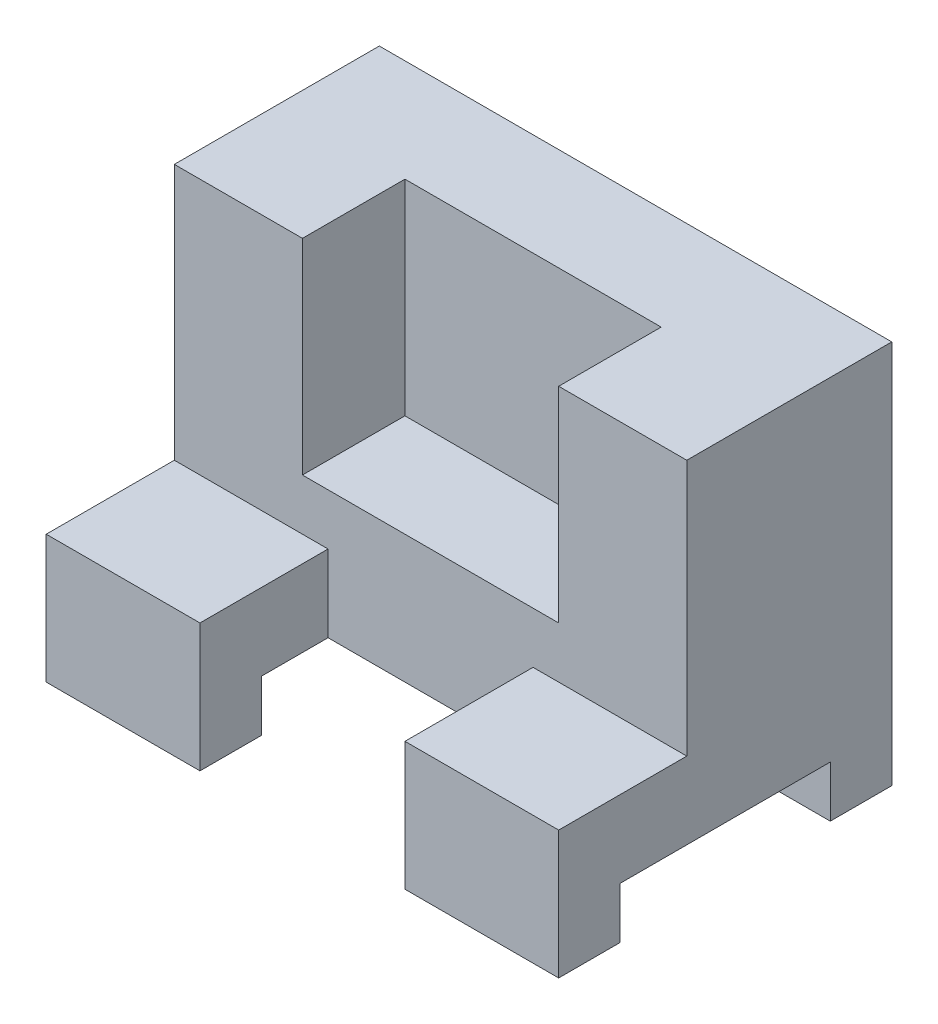
ISO-10303-21;
HEADER;
FILE_DESCRIPTION(('STEP AP214'),'2;1');
FILE_NAME('part.step','',(''),(''),'','','');
FILE_SCHEMA(('AUTOMOTIVE_DESIGN { 1 0 10303 214 1 1 1 1 }'));
ENDSEC;
DATA;
#1=APPLICATION_CONTEXT('core data for automotive mechanical design processes');
#2=APPLICATION_PROTOCOL_DEFINITION('international standard','automotive_design',2000,#1);
#3=PRODUCT_CONTEXT('',#1,'mechanical');
#4=PRODUCT('Part','Part','',(#3));
#5=PRODUCT_RELATED_PRODUCT_CATEGORY('part','',(#4));
#6=PRODUCT_DEFINITION_FORMATION('','',#4);
#7=PRODUCT_DEFINITION_CONTEXT('part definition',#1,'design');
#8=PRODUCT_DEFINITION('design','',#6,#7);
#9=PRODUCT_DEFINITION_SHAPE('','',#8);
#10=(LENGTH_UNIT() NAMED_UNIT(*) SI_UNIT(.MILLI.,.METRE.));
#11=(NAMED_UNIT(*) PLANE_ANGLE_UNIT() SI_UNIT($,.RADIAN.));
#12=(NAMED_UNIT(*) SI_UNIT($,.STERADIAN.) SOLID_ANGLE_UNIT());
#13=UNCERTAINTY_MEASURE_WITH_UNIT(LENGTH_MEASURE(1.E-05),#10,'distance_accuracy_value','');
#14=(GEOMETRIC_REPRESENTATION_CONTEXT(3) GLOBAL_UNCERTAINTY_ASSIGNED_CONTEXT((#13)) GLOBAL_UNIT_ASSIGNED_CONTEXT((#10,
#11,#12)) REPRESENTATION_CONTEXT('',''));
#15=CARTESIAN_POINT('',(0.,0.,0.));
#16=DIRECTION('',(0.,0.,1.));
#17=DIRECTION('',(1.,0.,0.));
#18=AXIS2_PLACEMENT_3D('',#15,#16,#17);
#19=CARTESIAN_POINT('',(0.,-65.,40.));
#20=DIRECTION('',(0.,1.,0.));
#21=DIRECTION('',(0.,0.,1.));
#22=AXIS2_PLACEMENT_3D('',#19,#20,#21);
#23=PLANE('',#22);
#24=DIRECTION('',(-1.,0.,0.));
#25=VECTOR('',#24,1.);
#26=CARTESIAN_POINT('',(0.,-65.,12.));
#27=LINE('',#26,#25);
#28=CARTESIAN_POINT('',(100.,-65.,12.));
#29=VERTEX_POINT('',#28);
#30=CARTESIAN_POINT('',(0.,-65.,12.));
#31=VERTEX_POINT('',#30);
#32=EDGE_CURVE('E207',#29,#31,#27,.T.);
#33=ORIENTED_EDGE('',*,*,#32,.F.);
#34=DIRECTION('',(0.,0.,-1.));
#35=VECTOR('',#34,1.);
#36=CARTESIAN_POINT('',(100.,-65.,40.));
#37=LINE('',#36,#35);
#38=CARTESIAN_POINT('',(100.,-65.,53.));
#39=VERTEX_POINT('',#38);
#40=EDGE_CURVE('E189',#39,#29,#37,.T.);
#41=ORIENTED_EDGE('',*,*,#40,.F.);
#42=DIRECTION('',(1.,0.,0.));
#43=VECTOR('',#42,1.);
#44=CARTESIAN_POINT('',(0.,-65.,53.));
#45=LINE('',#44,#43);
#46=CARTESIAN_POINT('',(70.,-65.,53.));
#47=VERTEX_POINT('',#46);
#48=EDGE_CURVE('E195',#47,#39,#45,.T.);
#49=ORIENTED_EDGE('',*,*,#48,.F.);
#50=DIRECTION('',(0.,0.,1.));
#51=VECTOR('',#50,1.);
#52=CARTESIAN_POINT('',(70.,-65.,65.));
#53=LINE('',#52,#51);
#54=CARTESIAN_POINT('',(70.,-65.,40.));
#55=VERTEX_POINT('',#54);
#56=EDGE_CURVE('E11',#55,#47,#53,.T.);
#57=ORIENTED_EDGE('',*,*,#56,.F.);
#58=DIRECTION('',(1.,0.,0.));
#59=VECTOR('',#58,1.);
#60=CARTESIAN_POINT('',(0.,-65.,40.));
#61=LINE('',#60,#59);
#62=CARTESIAN_POINT('',(30.,-65.,40.));
#63=VERTEX_POINT('',#62);
#64=EDGE_CURVE('E309',#63,#55,#61,.T.);
#65=ORIENTED_EDGE('',*,*,#64,.F.);
#66=DIRECTION('',(0.,0.,1.));
#67=VECTOR('',#66,1.);
#68=CARTESIAN_POINT('',(30.,-65.,65.));
#69=LINE('',#68,#67);
#70=CARTESIAN_POINT('',(30.,-65.,53.));
#71=VERTEX_POINT('',#70);
#72=EDGE_CURVE('E193',#63,#71,#69,.T.);
#73=ORIENTED_EDGE('',*,*,#72,.T.);
#74=CARTESIAN_POINT('',(0.,-65.,53.));
#75=VERTEX_POINT('',#74);
#76=EDGE_CURVE('E191',#75,#71,#45,.T.);
#77=ORIENTED_EDGE('',*,*,#76,.F.);
#78=DIRECTION('',(0.,0.,-1.));
#79=VECTOR('',#78,1.);
#80=CARTESIAN_POINT('',(0.,-65.,40.));
#81=LINE('',#80,#79);
#82=EDGE_CURVE('E178',#75,#31,#81,.T.);
#83=ORIENTED_EDGE('',*,*,#82,.T.);
#84=EDGE_LOOP('',(#33,#41,#49,#57,#65,#73,#77,#83));
#85=FACE_BOUND('',#84,.T.);
#86=ADVANCED_FACE('F39',(#85),#23,.F.);
#87=CARTESIAN_POINT('',(0.,0.,40.));
#88=DIRECTION('',(0.,0.,1.));
#89=DIRECTION('',(1.,0.,0.));
#90=AXIS2_PLACEMENT_3D('',#87,#88,#89);
#91=PLANE('',#90);
#92=DIRECTION('',(0.,-1.,0.));
#93=VECTOR('',#92,1.);
#94=CARTESIAN_POINT('',(70.,0.,40.));
#95=LINE('',#94,#93);
#96=CARTESIAN_POINT('',(70.,-50.,40.));
#97=VERTEX_POINT('',#96);
#98=EDGE_CURVE('E228',#97,#55,#95,.T.);
#99=ORIENTED_EDGE('',*,*,#98,.F.);
#100=DIRECTION('',(-1.,0.,0.));
#101=VECTOR('',#100,1.);
#102=CARTESIAN_POINT('',(0.,-50.,40.));
#103=LINE('',#102,#101);
#104=CARTESIAN_POINT('',(100.,-50.,40.));
#105=VERTEX_POINT('',#104);
#106=EDGE_CURVE('E223',#105,#97,#103,.T.);
#107=ORIENTED_EDGE('',*,*,#106,.F.);
#108=DIRECTION('',(0.,1.,0.));
#109=VECTOR('',#108,1.);
#110=CARTESIAN_POINT('',(100.,0.,40.));
#111=LINE('',#110,#109);
#112=CARTESIAN_POINT('',(100.,0.,40.));
#113=VERTEX_POINT('',#112);
#114=EDGE_CURVE('E313',#105,#113,#111,.T.);
#115=ORIENTED_EDGE('',*,*,#114,.T.);
#116=DIRECTION('',(-1.,0.,0.));
#117=VECTOR('',#116,1.);
#118=CARTESIAN_POINT('',(0.,0.,40.));
#119=LINE('',#118,#117);
#120=CARTESIAN_POINT('',(75.,0.,40.));
#121=VERTEX_POINT('',#120);
#122=EDGE_CURVE('E316',#113,#121,#119,.T.);
#123=ORIENTED_EDGE('',*,*,#122,.T.);
#124=DIRECTION('',(0.,1.,0.));
#125=VECTOR('',#124,1.);
#126=CARTESIAN_POINT('',(75.,-40.,40.));
#127=LINE('',#126,#125);
#128=CARTESIAN_POINT('',(75.,-40.,40.));
#129=VERTEX_POINT('',#128);
#130=EDGE_CURVE('E290',#129,#121,#127,.T.);
#131=ORIENTED_EDGE('',*,*,#130,.F.);
#132=DIRECTION('',(1.,0.,0.));
#133=VECTOR('',#132,1.);
#134=CARTESIAN_POINT('',(75.,-40.,40.));
#135=LINE('',#134,#133);
#136=CARTESIAN_POINT('',(25.,-40.,40.));
#137=VERTEX_POINT('',#136);
#138=EDGE_CURVE('E278',#137,#129,#135,.T.);
#139=ORIENTED_EDGE('',*,*,#138,.F.);
#140=DIRECTION('',(0.,1.,0.));
#141=VECTOR('',#140,1.);
#142=CARTESIAN_POINT('',(25.,-40.,40.));
#143=LINE('',#142,#141);
#144=CARTESIAN_POINT('',(25.,0.,40.));
#145=VERTEX_POINT('',#144);
#146=EDGE_CURVE('E297',#137,#145,#143,.T.);
#147=ORIENTED_EDGE('',*,*,#146,.T.);
#148=CARTESIAN_POINT('',(0.,0.,40.));
#149=VERTEX_POINT('',#148);
#150=EDGE_CURVE('E315',#145,#149,#119,.T.);
#151=ORIENTED_EDGE('',*,*,#150,.T.);
#152=DIRECTION('',(0.,-1.,0.));
#153=VECTOR('',#152,1.);
#154=CARTESIAN_POINT('',(0.,0.,40.));
#155=LINE('',#154,#153);
#156=CARTESIAN_POINT('',(0.,-50.,40.));
#157=VERTEX_POINT('',#156);
#158=EDGE_CURVE('E306',#149,#157,#155,.T.);
#159=ORIENTED_EDGE('',*,*,#158,.T.);
#160=DIRECTION('',(1.,0.,0.));
#161=VECTOR('',#160,1.);
#162=CARTESIAN_POINT('',(0.,-50.,40.));
#163=LINE('',#162,#161);
#164=CARTESIAN_POINT('',(30.,-50.,40.));
#165=VERTEX_POINT('',#164);
#166=EDGE_CURVE('E255',#157,#165,#163,.T.);
#167=ORIENTED_EDGE('',*,*,#166,.T.);
#168=DIRECTION('',(0.,-1.,0.));
#169=VECTOR('',#168,1.);
#170=CARTESIAN_POINT('',(30.,0.,40.));
#171=LINE('',#170,#169);
#172=EDGE_CURVE('E250',#165,#63,#171,.T.);
#173=ORIENTED_EDGE('',*,*,#172,.T.);
#174=ORIENTED_EDGE('',*,*,#64,.T.);
#175=EDGE_LOOP('',(#99,#107,#115,#123,#131,#139,#147,#151,#159,#167,#173,#174));
#176=FACE_BOUND('',#175,.T.);
#177=ADVANCED_FACE('F370',(#176),#91,.T.);
#178=CARTESIAN_POINT('',(0.,0.,40.));
#179=DIRECTION('',(1.,0.,0.));
#180=DIRECTION('',(0.,1.,0.));
#181=AXIS2_PLACEMENT_3D('',#178,#179,#180);
#182=PLANE('',#181);
#183=ORIENTED_EDGE('',*,*,#82,.F.);
#184=DIRECTION('',(0.,-1.,0.));
#185=VECTOR('',#184,1.);
#186=CARTESIAN_POINT('',(0.,-75.,53.));
#187=LINE('',#186,#185);
#188=CARTESIAN_POINT('',(0.,-75.,53.));
#189=VERTEX_POINT('',#188);
#190=EDGE_CURVE('E182',#75,#189,#187,.T.);
#191=ORIENTED_EDGE('',*,*,#190,.T.);
#192=DIRECTION('',(0.,0.,-1.));
#193=VECTOR('',#192,1.);
#194=CARTESIAN_POINT('',(0.,-75.,65.));
#195=LINE('',#194,#193);
#196=CARTESIAN_POINT('',(0.,-75.,65.));
#197=VERTEX_POINT('',#196);
#198=EDGE_CURVE('E270',#197,#189,#195,.T.);
#199=ORIENTED_EDGE('',*,*,#198,.F.);
#200=DIRECTION('',(0.,-1.,0.));
#201=VECTOR('',#200,1.);
#202=CARTESIAN_POINT('',(0.,0.,65.));
#203=LINE('',#202,#201);
#204=CARTESIAN_POINT('',(0.,-50.,65.));
#205=VERTEX_POINT('',#204);
#206=EDGE_CURVE('E258',#205,#197,#203,.T.);
#207=ORIENTED_EDGE('',*,*,#206,.F.);
#208=DIRECTION('',(0.,0.,-1.));
#209=VECTOR('',#208,1.);
#210=CARTESIAN_POINT('',(0.,-50.,65.));
#211=LINE('',#210,#209);
#212=EDGE_CURVE('E272',#205,#157,#211,.T.);
#213=ORIENTED_EDGE('',*,*,#212,.T.);
#214=ORIENTED_EDGE('',*,*,#158,.F.);
#215=DIRECTION('',(0.,0.,-1.));
#216=VECTOR('',#215,1.);
#217=CARTESIAN_POINT('',(0.,0.,40.));
#218=LINE('',#217,#216);
#219=CARTESIAN_POINT('',(0.,0.,0.));
#220=VERTEX_POINT('',#219);
#221=EDGE_CURVE('E319',#149,#220,#218,.T.);
#222=ORIENTED_EDGE('',*,*,#221,.T.);
#223=DIRECTION('',(0.,-1.,0.));
#224=VECTOR('',#223,1.);
#225=CARTESIAN_POINT('',(0.,0.,0.));
#226=LINE('',#225,#224);
#227=CARTESIAN_POINT('',(0.,-75.,0.));
#228=VERTEX_POINT('',#227);
#229=EDGE_CURVE('E300',#220,#228,#226,.T.);
#230=ORIENTED_EDGE('',*,*,#229,.T.);
#231=DIRECTION('',(0.,0.,-1.));
#232=VECTOR('',#231,1.);
#233=CARTESIAN_POINT('',(0.,-75.,0.));
#234=LINE('',#233,#232);
#235=CARTESIAN_POINT('',(0.,-75.,12.));
#236=VERTEX_POINT('',#235);
#237=EDGE_CURVE('E208',#236,#228,#234,.T.);
#238=ORIENTED_EDGE('',*,*,#237,.F.);
#239=DIRECTION('',(0.,1.,0.));
#240=VECTOR('',#239,1.);
#241=CARTESIAN_POINT('',(0.,-75.,12.));
#242=LINE('',#241,#240);
#243=EDGE_CURVE('E186',#236,#31,#242,.T.);
#244=ORIENTED_EDGE('',*,*,#243,.T.);
#245=EDGE_LOOP('',(#183,#191,#199,#207,#213,#214,#222,#230,#238,#244));
#246=FACE_BOUND('',#245,.T.);
#247=ADVANCED_FACE('F41',(#246),#182,.F.);
#248=CARTESIAN_POINT('',(100.,0.,40.));
#249=DIRECTION('',(-1.,0.,0.));
#250=DIRECTION('',(0.,-1.,0.));
#251=AXIS2_PLACEMENT_3D('',#248,#249,#250);
#252=PLANE('',#251);
#253=DIRECTION('',(0.,0.,-1.));
#254=VECTOR('',#253,1.);
#255=CARTESIAN_POINT('',(100.,-75.,65.));
#256=LINE('',#255,#254);
#257=CARTESIAN_POINT('',(100.,-75.,65.));
#258=VERTEX_POINT('',#257);
#259=CARTESIAN_POINT('',(100.,-75.,53.));
#260=VERTEX_POINT('',#259);
#261=EDGE_CURVE('E241',#258,#260,#256,.T.);
#262=ORIENTED_EDGE('',*,*,#261,.T.);
#263=DIRECTION('',(0.,-1.,0.));
#264=VECTOR('',#263,1.);
#265=CARTESIAN_POINT('',(100.,-75.,53.));
#266=LINE('',#265,#264);
#267=EDGE_CURVE('E62',#39,#260,#266,.T.);
#268=ORIENTED_EDGE('',*,*,#267,.F.);
#269=ORIENTED_EDGE('',*,*,#40,.T.);
#270=DIRECTION('',(0.,1.,0.));
#271=VECTOR('',#270,1.);
#272=CARTESIAN_POINT('',(100.,-75.,12.));
#273=LINE('',#272,#271);
#274=CARTESIAN_POINT('',(100.,-75.,12.));
#275=VERTEX_POINT('',#274);
#276=EDGE_CURVE('E220',#275,#29,#273,.T.);
#277=ORIENTED_EDGE('',*,*,#276,.F.);
#278=DIRECTION('',(0.,0.,1.));
#279=VECTOR('',#278,1.);
#280=CARTESIAN_POINT('',(100.,-75.,0.));
#281=LINE('',#280,#279);
#282=CARTESIAN_POINT('',(100.,-75.,0.));
#283=VERTEX_POINT('',#282);
#284=EDGE_CURVE('E214',#283,#275,#281,.T.);
#285=ORIENTED_EDGE('',*,*,#284,.F.);
#286=DIRECTION('',(0.,1.,0.));
#287=VECTOR('',#286,1.);
#288=CARTESIAN_POINT('',(100.,0.,0.));
#289=LINE('',#288,#287);
#290=CARTESIAN_POINT('',(100.,0.,0.));
#291=VERTEX_POINT('',#290);
#292=EDGE_CURVE('E321',#283,#291,#289,.T.);
#293=ORIENTED_EDGE('',*,*,#292,.T.);
#294=DIRECTION('',(0.,0.,-1.));
#295=VECTOR('',#294,1.);
#296=CARTESIAN_POINT('',(100.,0.,40.));
#297=LINE('',#296,#295);
#298=EDGE_CURVE('E326',#113,#291,#297,.T.);
#299=ORIENTED_EDGE('',*,*,#298,.F.);
#300=ORIENTED_EDGE('',*,*,#114,.F.);
#301=DIRECTION('',(0.,0.,-1.));
#302=VECTOR('',#301,1.);
#303=CARTESIAN_POINT('',(100.,-50.,65.));
#304=LINE('',#303,#302);
#305=CARTESIAN_POINT('',(100.,-50.,65.));
#306=VERTEX_POINT('',#305);
#307=EDGE_CURVE('E234',#306,#105,#304,.T.);
#308=ORIENTED_EDGE('',*,*,#307,.F.);
#309=DIRECTION('',(0.,1.,0.));
#310=VECTOR('',#309,1.);
#311=CARTESIAN_POINT('',(100.,0.,65.));
#312=LINE('',#311,#310);
#313=EDGE_CURVE('E232',#258,#306,#312,.T.);
#314=ORIENTED_EDGE('',*,*,#313,.F.);
#315=EDGE_LOOP('',(#262,#268,#269,#277,#285,#293,#299,#300,#308,#314));
#316=FACE_BOUND('',#315,.T.);
#317=ADVANCED_FACE('F337',(#316),#252,.F.);
#318=CARTESIAN_POINT('',(0.,0.,40.));
#319=DIRECTION('',(0.,-1.,0.));
#320=DIRECTION('',(0.,0.,-1.));
#321=AXIS2_PLACEMENT_3D('',#318,#319,#320);
#322=PLANE('',#321);
#323=ORIENTED_EDGE('',*,*,#150,.F.);
#324=DIRECTION('',(0.,0.,1.));
#325=VECTOR('',#324,1.);
#326=CARTESIAN_POINT('',(25.,0.,40.));
#327=LINE('',#326,#325);
#328=CARTESIAN_POINT('',(25.,0.,20.));
#329=VERTEX_POINT('',#328);
#330=EDGE_CURVE('E282',#329,#145,#327,.T.);
#331=ORIENTED_EDGE('',*,*,#330,.F.);
#332=DIRECTION('',(-1.,0.,0.));
#333=VECTOR('',#332,1.);
#334=CARTESIAN_POINT('',(25.,0.,20.));
#335=LINE('',#334,#333);
#336=CARTESIAN_POINT('',(75.,0.,20.));
#337=VERTEX_POINT('',#336);
#338=EDGE_CURVE('E293',#337,#329,#335,.T.);
#339=ORIENTED_EDGE('',*,*,#338,.F.);
#340=DIRECTION('',(0.,0.,-1.));
#341=VECTOR('',#340,1.);
#342=CARTESIAN_POINT('',(75.,0.,20.));
#343=LINE('',#342,#341);
#344=EDGE_CURVE('E277',#121,#337,#343,.T.);
#345=ORIENTED_EDGE('',*,*,#344,.F.);
#346=ORIENTED_EDGE('',*,*,#122,.F.);
#347=ORIENTED_EDGE('',*,*,#298,.T.);
#348=DIRECTION('',(-1.,0.,0.));
#349=VECTOR('',#348,1.);
#350=CARTESIAN_POINT('',(0.,0.,0.));
#351=LINE('',#350,#349);
#352=EDGE_CURVE('E310',#291,#220,#351,.T.);
#353=ORIENTED_EDGE('',*,*,#352,.T.);
#354=ORIENTED_EDGE('',*,*,#221,.F.);
#355=EDGE_LOOP('',(#323,#331,#339,#345,#346,#347,#353,#354));
#356=FACE_BOUND('',#355,.T.);
#357=ADVANCED_FACE('F361',(#356),#322,.F.);
#358=CARTESIAN_POINT('',(0.,0.,0.));
#359=DIRECTION('',(0.,0.,1.));
#360=DIRECTION('',(1.,0.,0.));
#361=AXIS2_PLACEMENT_3D('',#358,#359,#360);
#362=PLANE('',#361);
#363=ORIENTED_EDGE('',*,*,#229,.F.);
#364=ORIENTED_EDGE('',*,*,#352,.F.);
#365=ORIENTED_EDGE('',*,*,#292,.F.);
#366=DIRECTION('',(1.,0.,0.));
#367=VECTOR('',#366,1.);
#368=CARTESIAN_POINT('',(0.,-75.,0.));
#369=LINE('',#368,#367);
#370=EDGE_CURVE('E211',#228,#283,#369,.T.);
#371=ORIENTED_EDGE('',*,*,#370,.F.);
#372=EDGE_LOOP('',(#363,#364,#365,#371));
#373=FACE_BOUND('',#372,.T.);
#374=ADVANCED_FACE('F365',(#373),#362,.F.);
#375=CARTESIAN_POINT('',(25.,-40.,40.));
#376=DIRECTION('',(-1.,0.,0.));
#377=DIRECTION('',(0.,0.,1.));
#378=AXIS2_PLACEMENT_3D('',#375,#376,#377);
#379=PLANE('',#378);
#380=ORIENTED_EDGE('',*,*,#330,.T.);
#381=ORIENTED_EDGE('',*,*,#146,.F.);
#382=DIRECTION('',(0.,0.,1.));
#383=VECTOR('',#382,1.);
#384=CARTESIAN_POINT('',(25.,-40.,40.));
#385=LINE('',#384,#383);
#386=CARTESIAN_POINT('',(25.,-40.,20.));
#387=VERTEX_POINT('',#386);
#388=EDGE_CURVE('E288',#387,#137,#385,.T.);
#389=ORIENTED_EDGE('',*,*,#388,.F.);
#390=DIRECTION('',(0.,1.,0.));
#391=VECTOR('',#390,1.);
#392=CARTESIAN_POINT('',(25.,-40.,20.));
#393=LINE('',#392,#391);
#394=EDGE_CURVE('E301',#387,#329,#393,.T.);
#395=ORIENTED_EDGE('',*,*,#394,.T.);
#396=EDGE_LOOP('',(#380,#381,#389,#395));
#397=FACE_BOUND('',#396,.T.);
#398=ADVANCED_FACE('F376',(#397),#379,.F.);
#399=CARTESIAN_POINT('',(25.,-40.,20.));
#400=DIRECTION('',(0.,0.,-1.));
#401=DIRECTION('',(-1.,0.,0.));
#402=AXIS2_PLACEMENT_3D('',#399,#400,#401);
#403=PLANE('',#402);
#404=ORIENTED_EDGE('',*,*,#338,.T.);
#405=ORIENTED_EDGE('',*,*,#394,.F.);
#406=DIRECTION('',(-1.,0.,0.));
#407=VECTOR('',#406,1.);
#408=CARTESIAN_POINT('',(25.,-40.,20.));
#409=LINE('',#408,#407);
#410=CARTESIAN_POINT('',(75.,-40.,20.));
#411=VERTEX_POINT('',#410);
#412=EDGE_CURVE('E285',#411,#387,#409,.T.);
#413=ORIENTED_EDGE('',*,*,#412,.F.);
#414=DIRECTION('',(0.,1.,0.));
#415=VECTOR('',#414,1.);
#416=CARTESIAN_POINT('',(75.,-40.,20.));
#417=LINE('',#416,#415);
#418=EDGE_CURVE('E303',#411,#337,#417,.T.);
#419=ORIENTED_EDGE('',*,*,#418,.T.);
#420=EDGE_LOOP('',(#404,#405,#413,#419));
#421=FACE_BOUND('',#420,.T.);
#422=ADVANCED_FACE('F379',(#421),#403,.F.);
#423=CARTESIAN_POINT('',(75.,-40.,20.));
#424=DIRECTION('',(1.,0.,0.));
#425=DIRECTION('',(0.,0.,-1.));
#426=AXIS2_PLACEMENT_3D('',#423,#424,#425);
#427=PLANE('',#426);
#428=ORIENTED_EDGE('',*,*,#344,.T.);
#429=ORIENTED_EDGE('',*,*,#418,.F.);
#430=DIRECTION('',(0.,0.,-1.));
#431=VECTOR('',#430,1.);
#432=CARTESIAN_POINT('',(75.,-40.,20.));
#433=LINE('',#432,#431);
#434=EDGE_CURVE('E281',#129,#411,#433,.T.);
#435=ORIENTED_EDGE('',*,*,#434,.F.);
#436=ORIENTED_EDGE('',*,*,#130,.T.);
#437=EDGE_LOOP('',(#428,#429,#435,#436));
#438=FACE_BOUND('',#437,.T.);
#439=ADVANCED_FACE('F407',(#438),#427,.F.);
#440=CARTESIAN_POINT('',(0.,-40.,0.));
#441=DIRECTION('',(0.,-1.,0.));
#442=DIRECTION('',(0.,0.,-1.));
#443=AXIS2_PLACEMENT_3D('',#440,#441,#442);
#444=PLANE('',#443);
#445=ORIENTED_EDGE('',*,*,#138,.T.);
#446=ORIENTED_EDGE('',*,*,#434,.T.);
#447=ORIENTED_EDGE('',*,*,#412,.T.);
#448=ORIENTED_EDGE('',*,*,#388,.T.);
#449=EDGE_LOOP('',(#445,#446,#447,#448));
#450=FACE_BOUND('',#449,.T.);
#451=ADVANCED_FACE('F410',(#450),#444,.F.);
#452=CARTESIAN_POINT('',(30.,0.,65.));
#453=DIRECTION('',(1.,0.,0.));
#454=DIRECTION('',(0.,0.,-1.));
#455=AXIS2_PLACEMENT_3D('',#452,#453,#454);
#456=PLANE('',#455);
#457=DIRECTION('',(0.,-1.,0.));
#458=VECTOR('',#457,1.);
#459=CARTESIAN_POINT('',(30.,0.,53.));
#460=LINE('',#459,#458);
#461=CARTESIAN_POINT('',(30.,-75.,53.));
#462=VERTEX_POINT('',#461);
#463=EDGE_CURVE('E54',#71,#462,#460,.T.);
#464=ORIENTED_EDGE('',*,*,#463,.F.);
#465=ORIENTED_EDGE('',*,*,#72,.F.);
#466=ORIENTED_EDGE('',*,*,#172,.F.);
#467=DIRECTION('',(0.,0.,-1.));
#468=VECTOR('',#467,1.);
#469=CARTESIAN_POINT('',(30.,-50.,65.));
#470=LINE('',#469,#468);
#471=CARTESIAN_POINT('',(30.,-50.,65.));
#472=VERTEX_POINT('',#471);
#473=EDGE_CURVE('E274',#472,#165,#470,.T.);
#474=ORIENTED_EDGE('',*,*,#473,.F.);
#475=DIRECTION('',(0.,-1.,0.));
#476=VECTOR('',#475,1.);
#477=CARTESIAN_POINT('',(30.,0.,65.));
#478=LINE('',#477,#476);
#479=CARTESIAN_POINT('',(30.,-75.,65.));
#480=VERTEX_POINT('',#479);
#481=EDGE_CURVE('E251',#472,#480,#478,.T.);
#482=ORIENTED_EDGE('',*,*,#481,.T.);
#483=DIRECTION('',(0.,0.,-1.));
#484=VECTOR('',#483,1.);
#485=CARTESIAN_POINT('',(30.,-75.,65.));
#486=LINE('',#485,#484);
#487=EDGE_CURVE('E263',#480,#462,#486,.T.);
#488=ORIENTED_EDGE('',*,*,#487,.T.);
#489=EDGE_LOOP('',(#464,#465,#466,#474,#482,#488));
#490=FACE_BOUND('',#489,.T.);
#491=ADVANCED_FACE('F417',(#490),#456,.T.);
#492=CARTESIAN_POINT('',(0.,-50.,65.));
#493=DIRECTION('',(0.,1.,0.));
#494=DIRECTION('',(0.,0.,1.));
#495=AXIS2_PLACEMENT_3D('',#492,#493,#494);
#496=PLANE('',#495);
#497=ORIENTED_EDGE('',*,*,#166,.F.);
#498=ORIENTED_EDGE('',*,*,#212,.F.);
#499=DIRECTION('',(1.,0.,0.));
#500=VECTOR('',#499,1.);
#501=CARTESIAN_POINT('',(0.,-50.,65.));
#502=LINE('',#501,#500);
#503=EDGE_CURVE('E254',#205,#472,#502,.T.);
#504=ORIENTED_EDGE('',*,*,#503,.T.);
#505=ORIENTED_EDGE('',*,*,#473,.T.);
#506=EDGE_LOOP('',(#497,#498,#504,#505));
#507=FACE_BOUND('',#506,.T.);
#508=ADVANCED_FACE('F421',(#507),#496,.T.);
#509=CARTESIAN_POINT('',(0.,-75.,65.));
#510=DIRECTION('',(0.,-1.,0.));
#511=DIRECTION('',(0.,0.,-1.));
#512=AXIS2_PLACEMENT_3D('',#509,#510,#511);
#513=PLANE('',#512);
#514=DIRECTION('',(1.,0.,0.));
#515=VECTOR('',#514,1.);
#516=CARTESIAN_POINT('',(0.,-75.,53.));
#517=LINE('',#516,#515);
#518=EDGE_CURVE('E194',#189,#462,#517,.T.);
#519=ORIENTED_EDGE('',*,*,#518,.T.);
#520=ORIENTED_EDGE('',*,*,#487,.F.);
#521=DIRECTION('',(-1.,0.,0.));
#522=VECTOR('',#521,1.);
#523=CARTESIAN_POINT('',(0.,-75.,65.));
#524=LINE('',#523,#522);
#525=EDGE_CURVE('E260',#480,#197,#524,.T.);
#526=ORIENTED_EDGE('',*,*,#525,.T.);
#527=ORIENTED_EDGE('',*,*,#198,.T.);
#528=EDGE_LOOP('',(#519,#520,#526,#527));
#529=FACE_BOUND('',#528,.T.);
#530=ADVANCED_FACE('F392',(#529),#513,.T.);
#531=CARTESIAN_POINT('',(0.,0.,65.));
#532=DIRECTION('',(0.,0.,1.));
#533=DIRECTION('',(1.,0.,0.));
#534=AXIS2_PLACEMENT_3D('',#531,#532,#533);
#535=PLANE('',#534);
#536=ORIENTED_EDGE('',*,*,#481,.F.);
#537=ORIENTED_EDGE('',*,*,#503,.F.);
#538=ORIENTED_EDGE('',*,*,#206,.T.);
#539=ORIENTED_EDGE('',*,*,#525,.F.);
#540=EDGE_LOOP('',(#536,#537,#538,#539));
#541=FACE_BOUND('',#540,.T.);
#542=ADVANCED_FACE('F385',(#541),#535,.T.);
#543=CARTESIAN_POINT('',(0.,-50.,65.));
#544=DIRECTION('',(0.,-1.,0.));
#545=DIRECTION('',(1.,0.,0.));
#546=AXIS2_PLACEMENT_3D('',#543,#544,#545);
#547=PLANE('',#546);
#548=ORIENTED_EDGE('',*,*,#106,.T.);
#549=DIRECTION('',(0.,0.,-1.));
#550=VECTOR('',#549,1.);
#551=CARTESIAN_POINT('',(70.,-50.,65.));
#552=LINE('',#551,#550);
#553=CARTESIAN_POINT('',(70.,-50.,65.));
#554=VERTEX_POINT('',#553);
#555=EDGE_CURVE('E247',#554,#97,#552,.T.);
#556=ORIENTED_EDGE('',*,*,#555,.F.);
#557=DIRECTION('',(-1.,0.,0.));
#558=VECTOR('',#557,1.);
#559=CARTESIAN_POINT('',(0.,-50.,65.));
#560=LINE('',#559,#558);
#561=EDGE_CURVE('E224',#306,#554,#560,.T.);
#562=ORIENTED_EDGE('',*,*,#561,.F.);
#563=ORIENTED_EDGE('',*,*,#307,.T.);
#564=EDGE_LOOP('',(#548,#556,#562,#563));
#565=FACE_BOUND('',#564,.T.);
#566=ADVANCED_FACE('F383',(#565),#547,.F.);
#567=CARTESIAN_POINT('',(70.,0.,65.));
#568=DIRECTION('',(1.,0.,0.));
#569=DIRECTION('',(0.,1.,0.));
#570=AXIS2_PLACEMENT_3D('',#567,#568,#569);
#571=PLANE('',#570);
#572=ORIENTED_EDGE('',*,*,#56,.T.);
#573=DIRECTION('',(0.,-1.,0.));
#574=VECTOR('',#573,1.);
#575=CARTESIAN_POINT('',(70.,0.,53.));
#576=LINE('',#575,#574);
#577=CARTESIAN_POINT('',(70.,-75.,53.));
#578=VERTEX_POINT('',#577);
#579=EDGE_CURVE('E201',#47,#578,#576,.T.);
#580=ORIENTED_EDGE('',*,*,#579,.T.);
#581=DIRECTION('',(0.,0.,-1.));
#582=VECTOR('',#581,1.);
#583=CARTESIAN_POINT('',(70.,-75.,65.));
#584=LINE('',#583,#582);
#585=CARTESIAN_POINT('',(70.,-75.,65.));
#586=VERTEX_POINT('',#585);
#587=EDGE_CURVE('E244',#586,#578,#584,.T.);
#588=ORIENTED_EDGE('',*,*,#587,.F.);
#589=DIRECTION('',(0.,-1.,0.));
#590=VECTOR('',#589,1.);
#591=CARTESIAN_POINT('',(70.,0.,65.));
#592=LINE('',#591,#590);
#593=EDGE_CURVE('E227',#554,#586,#592,.T.);
#594=ORIENTED_EDGE('',*,*,#593,.F.);
#595=ORIENTED_EDGE('',*,*,#555,.T.);
#596=ORIENTED_EDGE('',*,*,#98,.T.);
#597=EDGE_LOOP('',(#572,#580,#588,#594,#595,#596));
#598=FACE_BOUND('',#597,.T.);
#599=ADVANCED_FACE('F344',(#598),#571,.F.);
#600=CARTESIAN_POINT('',(0.,-75.,65.));
#601=DIRECTION('',(0.,1.,0.));
#602=DIRECTION('',(0.,0.,1.));
#603=AXIS2_PLACEMENT_3D('',#600,#601,#602);
#604=PLANE('',#603);
#605=ORIENTED_EDGE('',*,*,#587,.T.);
#606=DIRECTION('',(1.,0.,0.));
#607=VECTOR('',#606,1.);
#608=CARTESIAN_POINT('',(0.,-75.,53.));
#609=LINE('',#608,#607);
#610=EDGE_CURVE('E47',#578,#260,#609,.T.);
#611=ORIENTED_EDGE('',*,*,#610,.T.);
#612=ORIENTED_EDGE('',*,*,#261,.F.);
#613=DIRECTION('',(1.,0.,0.));
#614=VECTOR('',#613,1.);
#615=CARTESIAN_POINT('',(0.,-75.,65.));
#616=LINE('',#615,#614);
#617=EDGE_CURVE('E230',#586,#258,#616,.T.);
#618=ORIENTED_EDGE('',*,*,#617,.F.);
#619=EDGE_LOOP('',(#605,#611,#612,#618));
#620=FACE_BOUND('',#619,.T.);
#621=ADVANCED_FACE('F332',(#620),#604,.F.);
#622=CARTESIAN_POINT('',(0.,0.,65.));
#623=DIRECTION('',(0.,0.,1.));
#624=DIRECTION('',(1.,0.,0.));
#625=AXIS2_PLACEMENT_3D('',#622,#623,#624);
#626=PLANE('',#625);
#627=ORIENTED_EDGE('',*,*,#561,.T.);
#628=ORIENTED_EDGE('',*,*,#593,.T.);
#629=ORIENTED_EDGE('',*,*,#617,.T.);
#630=ORIENTED_EDGE('',*,*,#313,.T.);
#631=EDGE_LOOP('',(#627,#628,#629,#630));
#632=FACE_BOUND('',#631,.T.);
#633=ADVANCED_FACE('F341',(#632),#626,.T.);
#634=CARTESIAN_POINT('',(0.,-75.,12.));
#635=DIRECTION('',(0.,0.,-1.));
#636=DIRECTION('',(-1.,0.,0.));
#637=AXIS2_PLACEMENT_3D('',#634,#635,#636);
#638=PLANE('',#637);
#639=ORIENTED_EDGE('',*,*,#32,.T.);
#640=ORIENTED_EDGE('',*,*,#243,.F.);
#641=DIRECTION('',(-1.,0.,0.));
#642=VECTOR('',#641,1.);
#643=CARTESIAN_POINT('',(0.,-75.,12.));
#644=LINE('',#643,#642);
#645=EDGE_CURVE('E216',#275,#236,#644,.T.);
#646=ORIENTED_EDGE('',*,*,#645,.F.);
#647=ORIENTED_EDGE('',*,*,#276,.T.);
#648=EDGE_LOOP('',(#639,#640,#646,#647));
#649=FACE_BOUND('',#648,.T.);
#650=ADVANCED_FACE('F351',(#649),#638,.F.);
#651=CARTESIAN_POINT('',(0.,-75.,0.));
#652=DIRECTION('',(0.,1.,0.));
#653=DIRECTION('',(0.,0.,1.));
#654=AXIS2_PLACEMENT_3D('',#651,#652,#653);
#655=PLANE('',#654);
#656=ORIENTED_EDGE('',*,*,#237,.T.);
#657=ORIENTED_EDGE('',*,*,#370,.T.);
#658=ORIENTED_EDGE('',*,*,#284,.T.);
#659=ORIENTED_EDGE('',*,*,#645,.T.);
#660=EDGE_LOOP('',(#656,#657,#658,#659));
#661=FACE_BOUND('',#660,.T.);
#662=ADVANCED_FACE('F353',(#661),#655,.F.);
#663=CARTESIAN_POINT('',(0.,-75.,53.));
#664=DIRECTION('',(0.,0.,1.));
#665=DIRECTION('',(1.,0.,0.));
#666=AXIS2_PLACEMENT_3D('',#663,#664,#665);
#667=PLANE('',#666);
#668=ORIENTED_EDGE('',*,*,#48,.T.);
#669=ORIENTED_EDGE('',*,*,#267,.T.);
#670=ORIENTED_EDGE('',*,*,#610,.F.);
#671=ORIENTED_EDGE('',*,*,#579,.F.);
#672=EDGE_LOOP('',(#668,#669,#670,#671));
#673=FACE_BOUND('',#672,.T.);
#674=ADVANCED_FACE('F346',(#673),#667,.F.);
#675=ORIENTED_EDGE('',*,*,#463,.T.);
#676=ORIENTED_EDGE('',*,*,#518,.F.);
#677=ORIENTED_EDGE('',*,*,#190,.F.);
#678=ORIENTED_EDGE('',*,*,#76,.T.);
#679=EDGE_LOOP('',(#675,#676,#677,#678));
#680=FACE_BOUND('',#679,.T.);
#681=ADVANCED_FACE('F197',(#680),#667,.F.);
#682=CLOSED_SHELL('',(#86,#177,#247,#317,#357,#374,#398,#422,#439,#451,#491,#508,#530,#542,#566,
#599,#621,#633,#650,#662,#674,#681));
#683=MANIFOLD_SOLID_BREP('B2',#682);
#684=ADVANCED_BREP_SHAPE_REPRESENTATION('',(#18,#683),#14);
#685=SHAPE_DEFINITION_REPRESENTATION(#9,#684);
ENDSEC;
END-ISO-10303-21;
